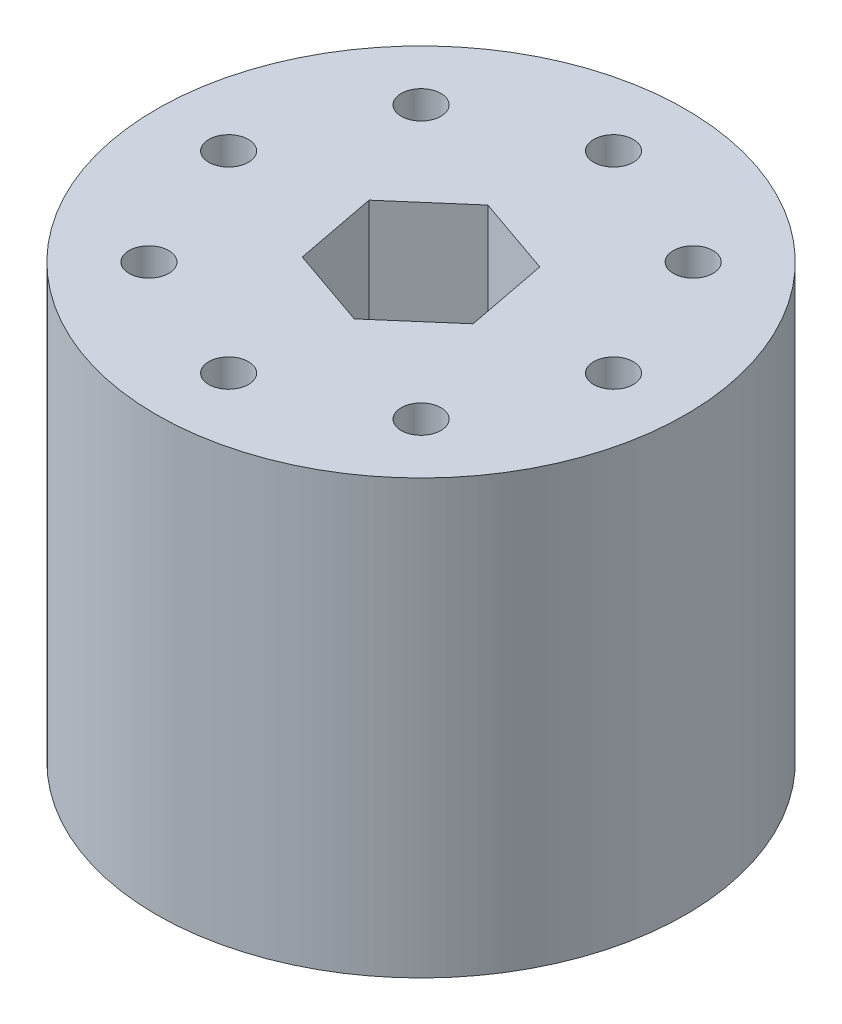
ISO-10303-21;
HEADER;
FILE_DESCRIPTION(('STEP AP214'),'2;1');
FILE_NAME('part.step','',(''),(''),'','','');
FILE_SCHEMA(('AUTOMOTIVE_DESIGN { 1 0 10303 214 1 1 1 1 }'));
ENDSEC;
DATA;
#1=APPLICATION_CONTEXT('core data for automotive mechanical design processes');
#2=APPLICATION_PROTOCOL_DEFINITION('international standard','automotive_design',2000,#1);
#3=PRODUCT_CONTEXT('',#1,'mechanical');
#4=PRODUCT('Part','Part','',(#3));
#5=PRODUCT_RELATED_PRODUCT_CATEGORY('part','',(#4));
#6=PRODUCT_DEFINITION_FORMATION('','',#4);
#7=PRODUCT_DEFINITION_CONTEXT('part definition',#1,'design');
#8=PRODUCT_DEFINITION('design','',#6,#7);
#9=PRODUCT_DEFINITION_SHAPE('','',#8);
#10=(LENGTH_UNIT() NAMED_UNIT(*) SI_UNIT(.MILLI.,.METRE.));
#11=(NAMED_UNIT(*) PLANE_ANGLE_UNIT() SI_UNIT($,.RADIAN.));
#12=(NAMED_UNIT(*) SI_UNIT($,.STERADIAN.) SOLID_ANGLE_UNIT());
#13=UNCERTAINTY_MEASURE_WITH_UNIT(LENGTH_MEASURE(1.E-05),#10,'distance_accuracy_value','');
#14=(GEOMETRIC_REPRESENTATION_CONTEXT(3) GLOBAL_UNCERTAINTY_ASSIGNED_CONTEXT((#13)) GLOBAL_UNIT_ASSIGNED_CONTEXT((#10,
#11,#12)) REPRESENTATION_CONTEXT('',''));
#15=CARTESIAN_POINT('',(0.,0.,0.));
#16=DIRECTION('',(0.,0.,1.));
#17=DIRECTION('',(1.,0.,0.));
#18=AXIS2_PLACEMENT_3D('',#15,#16,#17);
#19=CARTESIAN_POINT('',(0.,-12.,0.));
#20=DIRECTION('',(0.,1.,0.));
#21=DIRECTION('',(0.,0.,1.));
#22=AXIS2_PLACEMENT_3D('',#19,#20,#21);
#23=CYLINDRICAL_SURFACE('',#22,2.3);
#24=CARTESIAN_POINT('',(0.,26.,0.));
#25=DIRECTION('',(0.,1.,0.));
#26=DIRECTION('',(0.,0.,1.));
#27=AXIS2_PLACEMENT_3D('',#24,#25,#26);
#28=CIRCLE('',#27,2.3);
#29=CARTESIAN_POINT('',(0.,26.,2.3));
#30=VERTEX_POINT('',#29);
#31=EDGE_CURVE('E139',#30,#30,#28,.T.);
#32=ORIENTED_EDGE('',*,*,#31,.T.);
#33=EDGE_LOOP('',(#32));
#34=FACE_BOUND('',#33,.T.);
#35=CARTESIAN_POINT('',(0.,8.99999999999998,0.));
#36=DIRECTION('',(0.,-1.,0.));
#37=DIRECTION('',(0.,0.,-1.));
#38=AXIS2_PLACEMENT_3D('',#35,#36,#37);
#39=CIRCLE('',#38,2.3);
#40=CARTESIAN_POINT('',(0.,8.99999999999998,-2.3));
#41=VERTEX_POINT('',#40);
#42=EDGE_CURVE('E51',#41,#41,#39,.F.);
#43=ORIENTED_EDGE('',*,*,#42,.F.);
#44=EDGE_LOOP('',(#43));
#45=FACE_BOUND('',#44,.T.);
#46=ADVANCED_FACE('F47',(#34,#45),#23,.F.);
#47=CARTESIAN_POINT('',(0.,36.,0.));
#48=DIRECTION('',(0.,-1.,0.));
#49=DIRECTION('',(0.,0.,-1.));
#50=AXIS2_PLACEMENT_3D('',#47,#48,#49);
#51=CYLINDRICAL_SURFACE('',#50,22.);
#52=CARTESIAN_POINT('',(0.,36.,0.));
#53=DIRECTION('',(0.,1.,0.));
#54=DIRECTION('',(0.,0.,1.));
#55=AXIS2_PLACEMENT_3D('',#52,#53,#54);
#56=CIRCLE('',#55,22.);
#57=CARTESIAN_POINT('',(0.,36.,22.));
#58=VERTEX_POINT('',#57);
#59=EDGE_CURVE('E11',#58,#58,#56,.T.);
#60=ORIENTED_EDGE('',*,*,#59,.F.);
#61=EDGE_LOOP('',(#60));
#62=FACE_BOUND('',#61,.T.);
#63=CARTESIAN_POINT('',(0.,0.,0.));
#64=DIRECTION('',(0.,1.,0.));
#65=DIRECTION('',(0.,0.,1.));
#66=AXIS2_PLACEMENT_3D('',#63,#64,#65);
#67=CIRCLE('',#66,22.);
#68=CARTESIAN_POINT('',(0.,0.,22.));
#69=VERTEX_POINT('',#68);
#70=EDGE_CURVE('E56',#69,#69,#67,.T.);
#71=ORIENTED_EDGE('',*,*,#70,.T.);
#72=EDGE_LOOP('',(#71));
#73=FACE_BOUND('',#72,.T.);
#74=ADVANCED_FACE('F49',(#62,#73),#51,.T.);
#75=CARTESIAN_POINT('',(0.,36.,0.));
#76=DIRECTION('',(0.,1.,0.));
#77=DIRECTION('',(0.,0.,1.));
#78=AXIS2_PLACEMENT_3D('',#75,#76,#77);
#79=PLANE('',#78);
#80=DIRECTION('',(0.944854855791401,0.,0.327489391412012));
#81=VECTOR('',#80,1.);
#82=CARTESIAN_POINT('',(-5.29229092229886,36.,4.58166528608901));
#83=LINE('',#82,#81);
#84=CARTESIAN_POINT('',(-5.29229092229886,36.,4.58166528608901));
#85=VERTEX_POINT('',#84);
#86=CARTESIAN_POINT('',(1.32169306824095,36.,6.87409102597309));
#87=VERTEX_POINT('',#86);
#88=EDGE_CURVE('E64',#85,#87,#83,.T.);
#89=ORIENTED_EDGE('',*,*,#88,.F.);
#90=DIRECTION('',(0.188813295462993,0.,0.982013003710442));
#91=VECTOR('',#90,1.);
#92=CARTESIAN_POINT('',(-6.61398399053981,36.,-2.29242573988408));
#93=LINE('',#92,#91);
#94=CARTESIAN_POINT('',(-6.61398399053981,36.,-2.29242573988408));
#95=VERTEX_POINT('',#94);
#96=EDGE_CURVE('E148',#95,#85,#93,.T.);
#97=ORIENTED_EDGE('',*,*,#96,.F.);
#98=DIRECTION('',(-0.756041560328408,0.,0.65452361229843));
#99=VECTOR('',#98,1.);
#100=CARTESIAN_POINT('',(-1.32169306824095,36.,-6.8740910259731));
#101=LINE('',#100,#99);
#102=CARTESIAN_POINT('',(-1.32169306824095,36.,-6.8740910259731));
#103=VERTEX_POINT('',#102);
#104=EDGE_CURVE('E146',#103,#95,#101,.T.);
#105=ORIENTED_EDGE('',*,*,#104,.F.);
#106=DIRECTION('',(-0.944854855791401,0.,-0.327489391412012));
#107=VECTOR('',#106,1.);
#108=CARTESIAN_POINT('',(5.29229092229886,36.,-4.58166528608901));
#109=LINE('',#108,#107);
#110=CARTESIAN_POINT('',(5.29229092229886,36.,-4.58166528608901));
#111=VERTEX_POINT('',#110);
#112=EDGE_CURVE('E112',#111,#103,#109,.T.);
#113=ORIENTED_EDGE('',*,*,#112,.F.);
#114=DIRECTION('',(-0.188813295462993,0.,-0.982013003710442));
#115=VECTOR('',#114,1.);
#116=CARTESIAN_POINT('',(6.61398399053981,36.,2.29242573988408));
#117=LINE('',#116,#115);
#118=CARTESIAN_POINT('',(6.61398399053981,36.,2.29242573988408));
#119=VERTEX_POINT('',#118);
#120=EDGE_CURVE('E142',#119,#111,#117,.T.);
#121=ORIENTED_EDGE('',*,*,#120,.F.);
#122=DIRECTION('',(0.756041560328408,0.,-0.65452361229843));
#123=VECTOR('',#122,1.);
#124=CARTESIAN_POINT('',(1.32169306824095,36.,6.87409102597309));
#125=LINE('',#124,#123);
#126=EDGE_CURVE('E138',#87,#119,#125,.T.);
#127=ORIENTED_EDGE('',*,*,#126,.F.);
#128=EDGE_LOOP('',(#89,#97,#105,#113,#121,#127));
#129=FACE_BOUND('',#128,.T.);
#130=CARTESIAN_POINT('',(0.,36.,-16.0000000000006));
#131=DIRECTION('',(0.,1.,0.));
#132=DIRECTION('',(0.,0.,1.));
#133=AXIS2_PLACEMENT_3D('',#130,#131,#132);
#134=CIRCLE('',#133,1.65000000000066);
#135=CARTESIAN_POINT('',(0.,36.,-14.35));
#136=VERTEX_POINT('',#135);
#137=EDGE_CURVE('E180',#136,#136,#134,.T.);
#138=ORIENTED_EDGE('',*,*,#137,.F.);
#139=EDGE_LOOP('',(#138));
#140=FACE_BOUND('',#139,.T.);
#141=CARTESIAN_POINT('',(11.3137084989852,36.,-11.3137084989852));
#142=DIRECTION('',(0.,1.,0.));
#143=DIRECTION('',(0.,0.,1.));
#144=AXIS2_PLACEMENT_3D('',#141,#142,#143);
#145=CIRCLE('',#144,1.65000000000094);
#146=CARTESIAN_POINT('',(11.3137084989852,36.,-9.66370849898427));
#147=VERTEX_POINT('',#146);
#148=EDGE_CURVE('E186',#147,#147,#145,.T.);
#149=ORIENTED_EDGE('',*,*,#148,.F.);
#150=EDGE_LOOP('',(#149));
#151=FACE_BOUND('',#150,.T.);
#152=CARTESIAN_POINT('',(16.0000000000006,36.,0.));
#153=DIRECTION('',(0.,1.,0.));
#154=DIRECTION('',(0.,0.,1.));
#155=AXIS2_PLACEMENT_3D('',#152,#153,#154);
#156=CIRCLE('',#155,1.65000000000056);
#157=CARTESIAN_POINT('',(16.0000000000006,36.,1.65000000000056));
#158=VERTEX_POINT('',#157);
#159=EDGE_CURVE('E192',#158,#158,#156,.T.);
#160=ORIENTED_EDGE('',*,*,#159,.F.);
#161=EDGE_LOOP('',(#160));
#162=FACE_BOUND('',#161,.T.);
#163=CARTESIAN_POINT('',(11.3137084989852,36.,11.3137084989852));
#164=DIRECTION('',(0.,1.,0.));
#165=DIRECTION('',(0.,0.,1.));
#166=AXIS2_PLACEMENT_3D('',#163,#164,#165);
#167=CIRCLE('',#166,1.65000000000028);
#168=CARTESIAN_POINT('',(11.3137084989852,36.,12.9637084989855));
#169=VERTEX_POINT('',#168);
#170=EDGE_CURVE('E161',#169,#169,#167,.T.);
#171=ORIENTED_EDGE('',*,*,#170,.F.);
#172=EDGE_LOOP('',(#171));
#173=FACE_BOUND('',#172,.T.);
#174=CARTESIAN_POINT('',(0.,36.,16.0000000000006));
#175=DIRECTION('',(0.,1.,0.));
#176=DIRECTION('',(0.,0.,1.));
#177=AXIS2_PLACEMENT_3D('',#174,#175,#176);
#178=CIRCLE('',#177,1.65000000000076);
#179=CARTESIAN_POINT('',(0.,36.,17.6500000000014));
#180=VERTEX_POINT('',#179);
#181=EDGE_CURVE('E162',#180,#180,#178,.T.);
#182=ORIENTED_EDGE('',*,*,#181,.F.);
#183=EDGE_LOOP('',(#182));
#184=FACE_BOUND('',#183,.T.);
#185=CARTESIAN_POINT('',(-11.3137084989852,36.,11.3137084989852));
#186=DIRECTION('',(0.,1.,0.));
#187=DIRECTION('',(0.,0.,1.));
#188=AXIS2_PLACEMENT_3D('',#185,#186,#187);
#189=CIRCLE('',#188,1.65000000000048);
#190=CARTESIAN_POINT('',(-11.3137084989852,36.,12.9637084989857));
#191=VERTEX_POINT('',#190);
#192=EDGE_CURVE('E168',#191,#191,#189,.T.);
#193=ORIENTED_EDGE('',*,*,#192,.F.);
#194=EDGE_LOOP('',(#193));
#195=FACE_BOUND('',#194,.T.);
#196=CARTESIAN_POINT('',(-16.0000000000006,36.,0.));
#197=DIRECTION('',(0.,1.,0.));
#198=DIRECTION('',(0.,0.,1.));
#199=AXIS2_PLACEMENT_3D('',#196,#197,#198);
#200=CIRCLE('',#199,1.65000000000087);
#201=CARTESIAN_POINT('',(-16.0000000000006,36.,1.65000000000087));
#202=VERTEX_POINT('',#201);
#203=EDGE_CURVE('E152',#202,#202,#200,.T.);
#204=ORIENTED_EDGE('',*,*,#203,.F.);
#205=EDGE_LOOP('',(#204));
#206=FACE_BOUND('',#205,.T.);
#207=CARTESIAN_POINT('',(-11.3137084989852,36.,-11.3137084989852));
#208=DIRECTION('',(0.,1.,0.));
#209=DIRECTION('',(0.,0.,1.));
#210=AXIS2_PLACEMENT_3D('',#207,#208,#209);
#211=CIRCLE('',#210,1.65000000000114);
#212=CARTESIAN_POINT('',(-11.3137084989852,36.,-9.66370849898407));
#213=VERTEX_POINT('',#212);
#214=EDGE_CURVE('E179',#213,#213,#211,.T.);
#215=ORIENTED_EDGE('',*,*,#214,.F.);
#216=EDGE_LOOP('',(#215));
#217=FACE_BOUND('',#216,.T.);
#218=ORIENTED_EDGE('',*,*,#59,.T.);
#219=EDGE_LOOP('',(#218));
#220=FACE_BOUND('',#219,.T.);
#221=ADVANCED_FACE('F211',(#129,#140,#151,#162,#173,#184,#195,#206,#217,#220),#79,.T.);
#222=CARTESIAN_POINT('',(0.,0.,0.));
#223=DIRECTION('',(0.,1.,0.));
#224=DIRECTION('',(0.,0.,1.));
#225=AXIS2_PLACEMENT_3D('',#222,#223,#224);
#226=PLANE('',#225);
#227=CARTESIAN_POINT('',(0.,0.,0.));
#228=DIRECTION('',(0.,-1.,0.));
#229=DIRECTION('',(0.,0.,-1.));
#230=AXIS2_PLACEMENT_3D('',#227,#228,#229);
#231=CIRCLE('',#230,5.59540043034474);
#232=CARTESIAN_POINT('',(0.,0.,-5.59540043034474));
#233=VERTEX_POINT('',#232);
#234=EDGE_CURVE('E399',#233,#233,#231,.T.);
#235=ORIENTED_EDGE('',*,*,#234,.F.);
#236=EDGE_LOOP('',(#235));
#237=FACE_BOUND('',#236,.T.);
#238=CARTESIAN_POINT('',(0.,0.,-16.0000000000006));
#239=DIRECTION('',(0.,1.,0.));
#240=DIRECTION('',(0.,0.,1.));
#241=AXIS2_PLACEMENT_3D('',#238,#239,#240);
#242=CIRCLE('',#241,1.65000000000066);
#243=CARTESIAN_POINT('',(0.,0.,-14.35));
#244=VERTEX_POINT('',#243);
#245=EDGE_CURVE('E176',#244,#244,#242,.T.);
#246=ORIENTED_EDGE('',*,*,#245,.T.);
#247=EDGE_LOOP('',(#246));
#248=FACE_BOUND('',#247,.T.);
#249=CARTESIAN_POINT('',(11.3137084989852,0.,-11.3137084989852));
#250=DIRECTION('',(0.,1.,0.));
#251=DIRECTION('',(0.,0.,1.));
#252=AXIS2_PLACEMENT_3D('',#249,#250,#251);
#253=CIRCLE('',#252,1.65000000000094);
#254=CARTESIAN_POINT('',(11.3137084989852,0.,-9.66370849898427));
#255=VERTEX_POINT('',#254);
#256=EDGE_CURVE('E183',#255,#255,#253,.T.);
#257=ORIENTED_EDGE('',*,*,#256,.T.);
#258=EDGE_LOOP('',(#257));
#259=FACE_BOUND('',#258,.T.);
#260=CARTESIAN_POINT('',(16.0000000000006,0.,0.));
#261=DIRECTION('',(0.,1.,0.));
#262=DIRECTION('',(0.,0.,1.));
#263=AXIS2_PLACEMENT_3D('',#260,#261,#262);
#264=CIRCLE('',#263,1.65000000000056);
#265=CARTESIAN_POINT('',(16.0000000000006,0.,1.65000000000056));
#266=VERTEX_POINT('',#265);
#267=EDGE_CURVE('E189',#266,#266,#264,.T.);
#268=ORIENTED_EDGE('',*,*,#267,.T.);
#269=EDGE_LOOP('',(#268));
#270=FACE_BOUND('',#269,.T.);
#271=CARTESIAN_POINT('',(11.3137084989852,0.,11.3137084989852));
#272=DIRECTION('',(0.,1.,0.));
#273=DIRECTION('',(0.,0.,1.));
#274=AXIS2_PLACEMENT_3D('',#271,#272,#273);
#275=CIRCLE('',#274,1.65000000000028);
#276=CARTESIAN_POINT('',(11.3137084989852,0.,12.9637084989855));
#277=VERTEX_POINT('',#276);
#278=EDGE_CURVE('E195',#277,#277,#275,.T.);
#279=ORIENTED_EDGE('',*,*,#278,.T.);
#280=EDGE_LOOP('',(#279));
#281=FACE_BOUND('',#280,.T.);
#282=CARTESIAN_POINT('',(0.,0.,16.0000000000006));
#283=DIRECTION('',(0.,1.,0.));
#284=DIRECTION('',(0.,0.,1.));
#285=AXIS2_PLACEMENT_3D('',#282,#283,#284);
#286=CIRCLE('',#285,1.65000000000076);
#287=CARTESIAN_POINT('',(0.,0.,17.6500000000014));
#288=VERTEX_POINT('',#287);
#289=EDGE_CURVE('E158',#288,#288,#286,.T.);
#290=ORIENTED_EDGE('',*,*,#289,.T.);
#291=EDGE_LOOP('',(#290));
#292=FACE_BOUND('',#291,.T.);
#293=CARTESIAN_POINT('',(-11.3137084989852,0.,11.3137084989852));
#294=DIRECTION('',(0.,1.,0.));
#295=DIRECTION('',(0.,0.,1.));
#296=AXIS2_PLACEMENT_3D('',#293,#294,#295);
#297=CIRCLE('',#296,1.65000000000048);
#298=CARTESIAN_POINT('',(-11.3137084989852,0.,12.9637084989857));
#299=VERTEX_POINT('',#298);
#300=EDGE_CURVE('E165',#299,#299,#297,.T.);
#301=ORIENTED_EDGE('',*,*,#300,.T.);
#302=EDGE_LOOP('',(#301));
#303=FACE_BOUND('',#302,.T.);
#304=CARTESIAN_POINT('',(-16.0000000000006,0.,0.));
#305=DIRECTION('',(0.,1.,0.));
#306=DIRECTION('',(0.,0.,1.));
#307=AXIS2_PLACEMENT_3D('',#304,#305,#306);
#308=CIRCLE('',#307,1.65000000000087);
#309=CARTESIAN_POINT('',(-16.0000000000006,0.,1.65000000000087));
#310=VERTEX_POINT('',#309);
#311=EDGE_CURVE('E171',#310,#310,#308,.T.);
#312=ORIENTED_EDGE('',*,*,#311,.T.);
#313=EDGE_LOOP('',(#312));
#314=FACE_BOUND('',#313,.T.);
#315=CARTESIAN_POINT('',(-11.3137084989852,0.,-11.3137084989852));
#316=DIRECTION('',(0.,1.,0.));
#317=DIRECTION('',(0.,0.,1.));
#318=AXIS2_PLACEMENT_3D('',#315,#316,#317);
#319=CIRCLE('',#318,1.65000000000114);
#320=CARTESIAN_POINT('',(-11.3137084989852,0.,-9.66370849898407));
#321=VERTEX_POINT('',#320);
#322=EDGE_CURVE('E200',#321,#321,#319,.T.);
#323=ORIENTED_EDGE('',*,*,#322,.T.);
#324=EDGE_LOOP('',(#323));
#325=FACE_BOUND('',#324,.T.);
#326=ORIENTED_EDGE('',*,*,#70,.F.);
#327=EDGE_LOOP('',(#326));
#328=FACE_BOUND('',#327,.T.);
#329=ADVANCED_FACE('F208',(#237,#248,#259,#270,#281,#292,#303,#314,#325,#328),#226,.F.);
#330=CARTESIAN_POINT('',(-11.3137084989852,0.,-11.3137084989852));
#331=DIRECTION('',(0.,1.,0.));
#332=DIRECTION('',(0.,0.,1.));
#333=AXIS2_PLACEMENT_3D('',#330,#331,#332);
#334=CYLINDRICAL_SURFACE('',#333,1.65000000000114);
#335=ORIENTED_EDGE('',*,*,#322,.F.);
#336=EDGE_LOOP('',(#335));
#337=FACE_BOUND('',#336,.T.);
#338=ORIENTED_EDGE('',*,*,#214,.T.);
#339=EDGE_LOOP('',(#338));
#340=FACE_BOUND('',#339,.T.);
#341=ADVANCED_FACE('F210',(#337,#340),#334,.F.);
#342=CARTESIAN_POINT('',(-16.0000000000006,0.,0.));
#343=DIRECTION('',(0.,1.,0.));
#344=DIRECTION('',(0.,0.,1.));
#345=AXIS2_PLACEMENT_3D('',#342,#343,#344);
#346=CYLINDRICAL_SURFACE('',#345,1.65000000000087);
#347=ORIENTED_EDGE('',*,*,#311,.F.);
#348=EDGE_LOOP('',(#347));
#349=FACE_BOUND('',#348,.T.);
#350=ORIENTED_EDGE('',*,*,#203,.T.);
#351=EDGE_LOOP('',(#350));
#352=FACE_BOUND('',#351,.T.);
#353=ADVANCED_FACE('F218',(#349,#352),#346,.F.);
#354=CARTESIAN_POINT('',(-11.3137084989852,0.,11.3137084989852));
#355=DIRECTION('',(0.,1.,0.));
#356=DIRECTION('',(0.,0.,1.));
#357=AXIS2_PLACEMENT_3D('',#354,#355,#356);
#358=CYLINDRICAL_SURFACE('',#357,1.65000000000048);
#359=ORIENTED_EDGE('',*,*,#300,.F.);
#360=EDGE_LOOP('',(#359));
#361=FACE_BOUND('',#360,.T.);
#362=ORIENTED_EDGE('',*,*,#192,.T.);
#363=EDGE_LOOP('',(#362));
#364=FACE_BOUND('',#363,.T.);
#365=ADVANCED_FACE('F265',(#361,#364),#358,.F.);
#366=CARTESIAN_POINT('',(0.,0.,16.0000000000006));
#367=DIRECTION('',(0.,1.,0.));
#368=DIRECTION('',(0.,0.,1.));
#369=AXIS2_PLACEMENT_3D('',#366,#367,#368);
#370=CYLINDRICAL_SURFACE('',#369,1.65000000000076);
#371=ORIENTED_EDGE('',*,*,#289,.F.);
#372=EDGE_LOOP('',(#371));
#373=FACE_BOUND('',#372,.T.);
#374=ORIENTED_EDGE('',*,*,#181,.T.);
#375=EDGE_LOOP('',(#374));
#376=FACE_BOUND('',#375,.T.);
#377=ADVANCED_FACE('F261',(#373,#376),#370,.F.);
#378=CARTESIAN_POINT('',(11.3137084989852,0.,11.3137084989852));
#379=DIRECTION('',(0.,1.,0.));
#380=DIRECTION('',(0.,0.,1.));
#381=AXIS2_PLACEMENT_3D('',#378,#379,#380);
#382=CYLINDRICAL_SURFACE('',#381,1.65000000000028);
#383=ORIENTED_EDGE('',*,*,#278,.F.);
#384=EDGE_LOOP('',(#383));
#385=FACE_BOUND('',#384,.T.);
#386=ORIENTED_EDGE('',*,*,#170,.T.);
#387=EDGE_LOOP('',(#386));
#388=FACE_BOUND('',#387,.T.);
#389=ADVANCED_FACE('F264',(#385,#388),#382,.F.);
#390=CARTESIAN_POINT('',(16.0000000000006,0.,0.));
#391=DIRECTION('',(0.,1.,0.));
#392=DIRECTION('',(0.,0.,1.));
#393=AXIS2_PLACEMENT_3D('',#390,#391,#392);
#394=CYLINDRICAL_SURFACE('',#393,1.65000000000056);
#395=ORIENTED_EDGE('',*,*,#267,.F.);
#396=EDGE_LOOP('',(#395));
#397=FACE_BOUND('',#396,.T.);
#398=ORIENTED_EDGE('',*,*,#159,.T.);
#399=EDGE_LOOP('',(#398));
#400=FACE_BOUND('',#399,.T.);
#401=ADVANCED_FACE('F279',(#397,#400),#394,.F.);
#402=CARTESIAN_POINT('',(11.3137084989852,0.,-11.3137084989852));
#403=DIRECTION('',(0.,1.,0.));
#404=DIRECTION('',(0.,0.,1.));
#405=AXIS2_PLACEMENT_3D('',#402,#403,#404);
#406=CYLINDRICAL_SURFACE('',#405,1.65000000000094);
#407=ORIENTED_EDGE('',*,*,#256,.F.);
#408=EDGE_LOOP('',(#407));
#409=FACE_BOUND('',#408,.T.);
#410=ORIENTED_EDGE('',*,*,#148,.T.);
#411=EDGE_LOOP('',(#410));
#412=FACE_BOUND('',#411,.T.);
#413=ADVANCED_FACE('F275',(#409,#412),#406,.F.);
#414=CARTESIAN_POINT('',(0.,0.,-16.0000000000006));
#415=DIRECTION('',(0.,1.,0.));
#416=DIRECTION('',(0.,0.,1.));
#417=AXIS2_PLACEMENT_3D('',#414,#415,#416);
#418=CYLINDRICAL_SURFACE('',#417,1.65000000000066);
#419=ORIENTED_EDGE('',*,*,#245,.F.);
#420=EDGE_LOOP('',(#419));
#421=FACE_BOUND('',#420,.T.);
#422=ORIENTED_EDGE('',*,*,#137,.T.);
#423=EDGE_LOOP('',(#422));
#424=FACE_BOUND('',#423,.T.);
#425=ADVANCED_FACE('F260',(#421,#424),#418,.F.);
#426=CARTESIAN_POINT('',(-5.29229092229886,26.,4.58166528608901));
#427=DIRECTION('',(-0.327489391412012,0.,0.944854855791401));
#428=DIRECTION('',(0.944854855791401,0.,0.327489391412012));
#429=AXIS2_PLACEMENT_3D('',#426,#427,#428);
#430=PLANE('',#429);
#431=ORIENTED_EDGE('',*,*,#88,.T.);
#432=DIRECTION('',(0.,1.,0.));
#433=VECTOR('',#432,1.);
#434=CARTESIAN_POINT('',(1.32169306824095,26.,6.87409102597309));
#435=LINE('',#434,#433);
#436=CARTESIAN_POINT('',(1.32169306824095,26.,6.87409102597309));
#437=VERTEX_POINT('',#436);
#438=EDGE_CURVE('E94',#437,#87,#435,.T.);
#439=ORIENTED_EDGE('',*,*,#438,.F.);
#440=DIRECTION('',(0.944854855791401,0.,0.327489391412012));
#441=VECTOR('',#440,1.);
#442=CARTESIAN_POINT('',(-5.29229092229886,26.,4.58166528608901));
#443=LINE('',#442,#441);
#444=CARTESIAN_POINT('',(-5.29229092229886,26.,4.58166528608901));
#445=VERTEX_POINT('',#444);
#446=EDGE_CURVE('E150',#445,#437,#443,.T.);
#447=ORIENTED_EDGE('',*,*,#446,.F.);
#448=DIRECTION('',(0.,1.,0.));
#449=VECTOR('',#448,1.);
#450=CARTESIAN_POINT('',(-5.29229092229886,26.,4.58166528608901));
#451=LINE('',#450,#449);
#452=EDGE_CURVE('E72',#445,#85,#451,.T.);
#453=ORIENTED_EDGE('',*,*,#452,.T.);
#454=EDGE_LOOP('',(#431,#439,#447,#453));
#455=FACE_BOUND('',#454,.T.);
#456=ADVANCED_FACE('F246',(#455),#430,.F.);
#457=CARTESIAN_POINT('',(-6.61398399053981,26.,-2.29242573988408));
#458=DIRECTION('',(-0.982013003710442,0.,0.188813295462993));
#459=DIRECTION('',(0.188813295462993,0.,0.982013003710442));
#460=AXIS2_PLACEMENT_3D('',#457,#458,#459);
#461=PLANE('',#460);
#462=ORIENTED_EDGE('',*,*,#96,.T.);
#463=ORIENTED_EDGE('',*,*,#452,.F.);
#464=DIRECTION('',(0.188813295462993,0.,0.982013003710442));
#465=VECTOR('',#464,1.);
#466=CARTESIAN_POINT('',(-6.61398399053981,26.,-2.29242573988408));
#467=LINE('',#466,#465);
#468=CARTESIAN_POINT('',(-6.61398399053981,26.,-2.29242573988408));
#469=VERTEX_POINT('',#468);
#470=EDGE_CURVE('E124',#469,#445,#467,.T.);
#471=ORIENTED_EDGE('',*,*,#470,.F.);
#472=DIRECTION('',(0.,1.,0.));
#473=VECTOR('',#472,1.);
#474=CARTESIAN_POINT('',(-6.61398399053981,26.,-2.29242573988408));
#475=LINE('',#474,#473);
#476=EDGE_CURVE('E116',#469,#95,#475,.T.);
#477=ORIENTED_EDGE('',*,*,#476,.T.);
#478=EDGE_LOOP('',(#462,#463,#471,#477));
#479=FACE_BOUND('',#478,.T.);
#480=ADVANCED_FACE('F243',(#479),#461,.F.);
#481=CARTESIAN_POINT('',(-1.32169306824095,26.,-6.8740910259731));
#482=DIRECTION('',(-0.65452361229843,0.,-0.756041560328408));
#483=DIRECTION('',(-0.756041560328408,0.,0.65452361229843));
#484=AXIS2_PLACEMENT_3D('',#481,#482,#483);
#485=PLANE('',#484);
#486=ORIENTED_EDGE('',*,*,#104,.T.);
#487=ORIENTED_EDGE('',*,*,#476,.F.);
#488=DIRECTION('',(-0.756041560328408,0.,0.65452361229843));
#489=VECTOR('',#488,1.);
#490=CARTESIAN_POINT('',(-1.32169306824095,26.,-6.8740910259731));
#491=LINE('',#490,#489);
#492=CARTESIAN_POINT('',(-1.32169306824095,26.,-6.8740910259731));
#493=VERTEX_POINT('',#492);
#494=EDGE_CURVE('E120',#493,#469,#491,.T.);
#495=ORIENTED_EDGE('',*,*,#494,.F.);
#496=DIRECTION('',(0.,1.,0.));
#497=VECTOR('',#496,1.);
#498=CARTESIAN_POINT('',(-1.32169306824095,26.,-6.8740910259731));
#499=LINE('',#498,#497);
#500=EDGE_CURVE('E105',#493,#103,#499,.T.);
#501=ORIENTED_EDGE('',*,*,#500,.T.);
#502=EDGE_LOOP('',(#486,#487,#495,#501));
#503=FACE_BOUND('',#502,.T.);
#504=ADVANCED_FACE('F121',(#503),#485,.F.);
#505=CARTESIAN_POINT('',(5.29229092229886,26.,-4.58166528608901));
#506=DIRECTION('',(0.327489391412012,0.,-0.944854855791401));
#507=DIRECTION('',(-0.944854855791401,0.,-0.327489391412012));
#508=AXIS2_PLACEMENT_3D('',#505,#506,#507);
#509=PLANE('',#508);
#510=ORIENTED_EDGE('',*,*,#112,.T.);
#511=ORIENTED_EDGE('',*,*,#500,.F.);
#512=DIRECTION('',(-0.944854855791401,0.,-0.327489391412012));
#513=VECTOR('',#512,1.);
#514=CARTESIAN_POINT('',(5.29229092229886,26.,-4.58166528608901));
#515=LINE('',#514,#513);
#516=CARTESIAN_POINT('',(5.29229092229886,26.,-4.58166528608901));
#517=VERTEX_POINT('',#516);
#518=EDGE_CURVE('E109',#517,#493,#515,.T.);
#519=ORIENTED_EDGE('',*,*,#518,.F.);
#520=DIRECTION('',(0.,1.,0.));
#521=VECTOR('',#520,1.);
#522=CARTESIAN_POINT('',(5.29229092229886,26.,-4.58166528608901));
#523=LINE('',#522,#521);
#524=EDGE_CURVE('E117',#517,#111,#523,.T.);
#525=ORIENTED_EDGE('',*,*,#524,.T.);
#526=EDGE_LOOP('',(#510,#511,#519,#525));
#527=FACE_BOUND('',#526,.T.);
#528=ADVANCED_FACE('F107',(#527),#509,.F.);
#529=CARTESIAN_POINT('',(6.61398399053981,26.,2.29242573988408));
#530=DIRECTION('',(0.982013003710442,0.,-0.188813295462993));
#531=DIRECTION('',(-0.188813295462993,0.,-0.982013003710442));
#532=AXIS2_PLACEMENT_3D('',#529,#530,#531);
#533=PLANE('',#532);
#534=ORIENTED_EDGE('',*,*,#120,.T.);
#535=ORIENTED_EDGE('',*,*,#524,.F.);
#536=DIRECTION('',(-0.188813295462993,0.,-0.982013003710442));
#537=VECTOR('',#536,1.);
#538=CARTESIAN_POINT('',(6.61398399053981,26.,2.29242573988408));
#539=LINE('',#538,#537);
#540=CARTESIAN_POINT('',(6.61398399053981,26.,2.29242573988408));
#541=VERTEX_POINT('',#540);
#542=EDGE_CURVE('E130',#541,#517,#539,.T.);
#543=ORIENTED_EDGE('',*,*,#542,.F.);
#544=DIRECTION('',(0.,1.,0.));
#545=VECTOR('',#544,1.);
#546=CARTESIAN_POINT('',(6.61398399053981,26.,2.29242573988408));
#547=LINE('',#546,#545);
#548=EDGE_CURVE('E155',#541,#119,#547,.T.);
#549=ORIENTED_EDGE('',*,*,#548,.T.);
#550=EDGE_LOOP('',(#534,#535,#543,#549));
#551=FACE_BOUND('',#550,.T.);
#552=ADVANCED_FACE('F251',(#551),#533,.F.);
#553=CARTESIAN_POINT('',(1.32169306824095,26.,6.87409102597309));
#554=DIRECTION('',(0.65452361229843,0.,0.756041560328408));
#555=DIRECTION('',(0.756041560328409,0.,-0.65452361229843));
#556=AXIS2_PLACEMENT_3D('',#553,#554,#555);
#557=PLANE('',#556);
#558=ORIENTED_EDGE('',*,*,#126,.T.);
#559=ORIENTED_EDGE('',*,*,#548,.F.);
#560=DIRECTION('',(0.756041560328408,0.,-0.65452361229843));
#561=VECTOR('',#560,1.);
#562=CARTESIAN_POINT('',(1.32169306824095,26.,6.87409102597309));
#563=LINE('',#562,#561);
#564=EDGE_CURVE('E132',#437,#541,#563,.T.);
#565=ORIENTED_EDGE('',*,*,#564,.F.);
#566=ORIENTED_EDGE('',*,*,#438,.T.);
#567=EDGE_LOOP('',(#558,#559,#565,#566));
#568=FACE_BOUND('',#567,.T.);
#569=ADVANCED_FACE('F241',(#568),#557,.F.);
#570=CARTESIAN_POINT('',(0.,26.,0.));
#571=DIRECTION('',(0.,1.,0.));
#572=DIRECTION('',(0.,0.,1.));
#573=AXIS2_PLACEMENT_3D('',#570,#571,#572);
#574=PLANE('',#573);
#575=ORIENTED_EDGE('',*,*,#31,.F.);
#576=EDGE_LOOP('',(#575));
#577=FACE_BOUND('',#576,.T.);
#578=ORIENTED_EDGE('',*,*,#446,.T.);
#579=ORIENTED_EDGE('',*,*,#564,.T.);
#580=ORIENTED_EDGE('',*,*,#542,.T.);
#581=ORIENTED_EDGE('',*,*,#518,.T.);
#582=ORIENTED_EDGE('',*,*,#494,.T.);
#583=ORIENTED_EDGE('',*,*,#470,.T.);
#584=EDGE_LOOP('',(#578,#579,#580,#581,#582,#583));
#585=FACE_BOUND('',#584,.T.);
#586=ADVANCED_FACE('F127',(#577,#585),#574,.T.);
#587=CARTESIAN_POINT('',(0.,8.99999999999998,0.));
#588=DIRECTION('',(0.,-1.,0.));
#589=DIRECTION('',(0.,0.,-1.));
#590=AXIS2_PLACEMENT_3D('',#587,#588,#589);
#591=PLANE('',#590);
#592=CARTESIAN_POINT('',(0.,8.99999999999998,0.));
#593=DIRECTION('',(0.,-1.,0.));
#594=DIRECTION('',(0.,0.,-1.));
#595=AXIS2_PLACEMENT_3D('',#592,#593,#594);
#596=CIRCLE('',#595,5.59540043034474);
#597=CARTESIAN_POINT('',(0.,8.99999999999998,-5.59540043034474));
#598=VERTEX_POINT('',#597);
#599=EDGE_CURVE('E397',#598,#598,#596,.T.);
#600=ORIENTED_EDGE('',*,*,#599,.T.);
#601=EDGE_LOOP('',(#600));
#602=FACE_BOUND('',#601,.T.);
#603=ORIENTED_EDGE('',*,*,#42,.T.);
#604=EDGE_LOOP('',(#603));
#605=FACE_BOUND('',#604,.T.);
#606=ADVANCED_FACE('F240',(#602,#605),#591,.T.);
#607=CARTESIAN_POINT('',(0.,8.99999999999998,0.));
#608=DIRECTION('',(0.,-1.,0.));
#609=DIRECTION('',(0.,0.,-1.));
#610=AXIS2_PLACEMENT_3D('',#607,#608,#609);
#611=CYLINDRICAL_SURFACE('',#610,5.59540043034474);
#612=ORIENTED_EDGE('',*,*,#599,.F.);
#613=EDGE_LOOP('',(#612));
#614=FACE_BOUND('',#613,.T.);
#615=ORIENTED_EDGE('',*,*,#234,.T.);
#616=EDGE_LOOP('',(#615));
#617=FACE_BOUND('',#616,.T.);
#618=ADVANCED_FACE('F237',(#614,#617),#611,.F.);
#619=CLOSED_SHELL('',(#46,#74,#221,#329,#341,#353,#365,#377,#389,#401,#413,#425,#456,#480,#504,
#528,#552,#569,#586,#606,#618));
#620=MANIFOLD_SOLID_BREP('B2',#619);
#621=ADVANCED_BREP_SHAPE_REPRESENTATION('',(#18,#620),#14);
#622=SHAPE_DEFINITION_REPRESENTATION(#9,#621);
ENDSEC;
END-ISO-10303-21;
